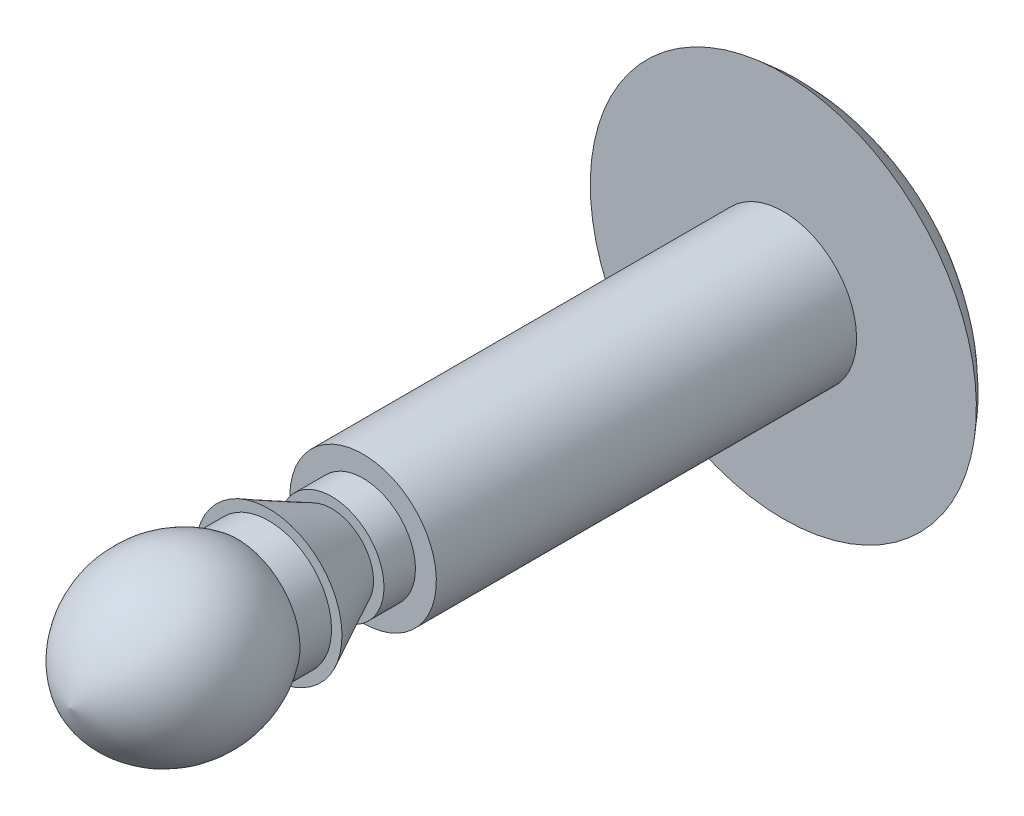
ISO-10303-21;
HEADER;
FILE_DESCRIPTION(('STEP AP214'),'2;1');
FILE_NAME('part.step','',(''),(''),'','','');
FILE_SCHEMA(('AUTOMOTIVE_DESIGN { 1 0 10303 214 1 1 1 1 }'));
ENDSEC;
DATA;
#1=APPLICATION_CONTEXT('core data for automotive mechanical design processes');
#2=APPLICATION_PROTOCOL_DEFINITION('international standard','automotive_design',2000,#1);
#3=PRODUCT_CONTEXT('',#1,'mechanical');
#4=PRODUCT('Part','Part','',(#3));
#5=PRODUCT_RELATED_PRODUCT_CATEGORY('part','',(#4));
#6=PRODUCT_DEFINITION_FORMATION('','',#4);
#7=PRODUCT_DEFINITION_CONTEXT('part definition',#1,'design');
#8=PRODUCT_DEFINITION('design','',#6,#7);
#9=PRODUCT_DEFINITION_SHAPE('','',#8);
#10=(LENGTH_UNIT() NAMED_UNIT(*) SI_UNIT(.MILLI.,.METRE.));
#11=(NAMED_UNIT(*) PLANE_ANGLE_UNIT() SI_UNIT($,.RADIAN.));
#12=(NAMED_UNIT(*) SI_UNIT($,.STERADIAN.) SOLID_ANGLE_UNIT());
#13=UNCERTAINTY_MEASURE_WITH_UNIT(LENGTH_MEASURE(1.E-05),#10,'distance_accuracy_value','');
#14=(GEOMETRIC_REPRESENTATION_CONTEXT(3) GLOBAL_UNCERTAINTY_ASSIGNED_CONTEXT((#13)) GLOBAL_UNIT_ASSIGNED_CONTEXT((#10,
#11,#12)) REPRESENTATION_CONTEXT('',''));
#15=CARTESIAN_POINT('',(0.,0.,0.));
#16=DIRECTION('',(0.,0.,1.));
#17=DIRECTION('',(1.,0.,0.));
#18=AXIS2_PLACEMENT_3D('',#15,#16,#17);
#19=CARTESIAN_POINT('',(0.,0.,-0.634999999999999));
#20=DIRECTION('',(0.,0.,1.));
#21=DIRECTION('',(0.,-1.,0.));
#22=AXIS2_PLACEMENT_3D('',#19,#20,#21);
#23=TOROIDAL_SURFACE('',#22,1.75895,0.762000000000001);
#24=CARTESIAN_POINT('',(0.,0.,-1.397));
#25=DIRECTION('',(0.,0.,1.));
#26=DIRECTION('',(0.,-1.,0.));
#27=AXIS2_PLACEMENT_3D('',#24,#25,#26);
#28=CIRCLE('',#27,1.75895);
#29=CARTESIAN_POINT('',(0.,-1.75895,-1.397));
#30=VERTEX_POINT('',#29);
#31=EDGE_CURVE('E78',#30,#30,#28,.T.);
#32=ORIENTED_EDGE('',*,*,#31,.F.);
#33=EDGE_LOOP('',(#32));
#34=FACE_BOUND('',#33,.T.);
#35=CARTESIAN_POINT('',(0.,0.,-1.016));
#36=DIRECTION('',(0.,0.,1.));
#37=DIRECTION('',(0.,-1.,0.));
#38=AXIS2_PLACEMENT_3D('',#35,#36,#37);
#39=CIRCLE('',#38,1.09903864231626);
#40=CARTESIAN_POINT('',(0.,-1.09903864231626,-1.016));
#41=VERTEX_POINT('',#40);
#42=EDGE_CURVE('E11',#41,#41,#39,.T.);
#43=ORIENTED_EDGE('',*,*,#42,.T.);
#44=EDGE_LOOP('',(#43));
#45=FACE_BOUND('',#44,.T.);
#46=ADVANCED_FACE('F32',(#34,#45),#23,.T.);
#47=CARTESIAN_POINT('',(0.,0.996949999999999,-1.016));
#48=DIRECTION('',(0.,0.,1.));
#49=DIRECTION('',(0.,-1.,0.));
#50=AXIS2_PLACEMENT_3D('',#47,#48,#49);
#51=PLANE('',#50);
#52=ORIENTED_EDGE('',*,*,#42,.F.);
#53=EDGE_LOOP('',(#52));
#54=FACE_BOUND('',#53,.T.);
#55=CARTESIAN_POINT('',(0.,0.,-1.016));
#56=DIRECTION('',(0.,0.,1.));
#57=DIRECTION('',(0.,-1.,0.));
#58=AXIS2_PLACEMENT_3D('',#55,#56,#57);
#59=CIRCLE('',#58,0.996949999999999);
#60=CARTESIAN_POINT('',(0.,-0.996949999999999,-1.016));
#61=VERTEX_POINT('',#60);
#62=EDGE_CURVE('E38',#61,#61,#59,.T.);
#63=ORIENTED_EDGE('',*,*,#62,.T.);
#64=EDGE_LOOP('',(#63));
#65=FACE_BOUND('',#64,.T.);
#66=ADVANCED_FACE('F98',(#54,#65),#51,.F.);
#67=CARTESIAN_POINT('',(0.,0.,9.66665911521708));
#68=DIRECTION('',(0.,0.,1.));
#69=DIRECTION('',(0.,-1.,0.));
#70=AXIS2_PLACEMENT_3D('',#67,#68,#69);
#71=CYLINDRICAL_SURFACE('',#70,0.996949999999999);
#72=CARTESIAN_POINT('',(0.,0.,-1.397));
#73=DIRECTION('',(0.,0.,1.));
#74=DIRECTION('',(1.,0.,0.));
#75=AXIS2_PLACEMENT_3D('',#72,#73,#74);
#76=CIRCLE('',#75,0.996949999999999);
#77=CARTESIAN_POINT('',(0.996949999999999,0.,-1.397));
#78=VERTEX_POINT('',#77);
#79=EDGE_CURVE('E81',#78,#78,#76,.T.);
#80=ORIENTED_EDGE('',*,*,#79,.T.);
#81=EDGE_LOOP('',(#80));
#82=FACE_BOUND('',#81,.T.);
#83=ORIENTED_EDGE('',*,*,#62,.F.);
#84=EDGE_LOOP('',(#83));
#85=FACE_BOUND('',#84,.T.);
#86=ADVANCED_FACE('F45',(#82,#85),#71,.T.);
#87=CARTESIAN_POINT('',(0.,0.542559025427277,14.5148481779648));
#88=DIRECTION('',(-1.,0.,0.));
#89=DIRECTION('',(0.,-1.,0.));
#90=AXIS2_PLACEMENT_3D('',#87,#88,#89);
#91=CIRCLE('',#90,2.53645902542728);
#92=TRIMMED_CURVE('',#91,(PARAMETER_VALUE(-1.35522648467591)),
(PARAMETER_VALUE(1.35522648467591)),.T.,.PARAMETER.);
#93=CARTESIAN_POINT('',(0.,0.,14.5148481779648));
#94=DIRECTION('',(0.,0.,1.));
#95=AXIS1_PLACEMENT('',#93,#94);
#96=SURFACE_OF_REVOLUTION('',#92,#95);
#97=CARTESIAN_POINT('',(0.,0.,16.9926));
#98=VERTEX_POINT('',#97);
#99=VERTEX_LOOP('',#98);
#100=FACE_BOUND('',#99,.T.);
#101=CARTESIAN_POINT('',(0.,0.,13.0048));
#102=DIRECTION('',(0.,0.,1.));
#103=DIRECTION('',(0.,-1.,0.));
#104=AXIS2_PLACEMENT_3D('',#101,#102,#103);
#105=CIRCLE('',#104,1.495425);
#106=CARTESIAN_POINT('',(0.,-1.495425,13.0048));
#107=VERTEX_POINT('',#106);
#108=EDGE_CURVE('E49',#107,#107,#105,.T.);
#109=ORIENTED_EDGE('',*,*,#108,.T.);
#110=EDGE_LOOP('',(#109));
#111=FACE_BOUND('',#110,.T.);
#112=ADVANCED_FACE('F41',(#100,#111),#96,.T.);
#113=CARTESIAN_POINT('',(0.,0.,9.66665911521708));
#114=DIRECTION('',(0.,0.,1.));
#115=DIRECTION('',(0.,-1.,0.));
#116=AXIS2_PLACEMENT_3D('',#113,#114,#115);
#117=CYLINDRICAL_SURFACE('',#116,1.495425);
#118=ORIENTED_EDGE('',*,*,#108,.F.);
#119=EDGE_LOOP('',(#118));
#120=FACE_BOUND('',#119,.T.);
#121=CARTESIAN_POINT('',(0.,0.,12.2555));
#122=DIRECTION('',(0.,0.,1.));
#123=DIRECTION('',(0.,-1.,0.));
#124=AXIS2_PLACEMENT_3D('',#121,#122,#123);
#125=CIRCLE('',#124,1.495425);
#126=CARTESIAN_POINT('',(0.,-1.495425,12.2555));
#127=VERTEX_POINT('',#126);
#128=EDGE_CURVE('E51',#127,#127,#125,.T.);
#129=ORIENTED_EDGE('',*,*,#128,.T.);
#130=EDGE_LOOP('',(#129));
#131=FACE_BOUND('',#130,.T.);
#132=ADVANCED_FACE('F44',(#120,#131),#117,.T.);
#133=CARTESIAN_POINT('',(0.,1.495425,12.2555));
#134=DIRECTION('',(0.,0.,-1.));
#135=DIRECTION('',(0.,1.,0.));
#136=AXIS2_PLACEMENT_3D('',#133,#134,#135);
#137=PLANE('',#136);
#138=ORIENTED_EDGE('',*,*,#128,.F.);
#139=EDGE_LOOP('',(#138));
#140=FACE_BOUND('',#139,.T.);
#141=CARTESIAN_POINT('',(0.,0.,12.2555));
#142=DIRECTION('',(0.,0.,1.));
#143=DIRECTION('',(0.,-1.,0.));
#144=AXIS2_PLACEMENT_3D('',#141,#142,#143);
#145=CIRCLE('',#144,1.7446625);
#146=CARTESIAN_POINT('',(0.,-1.7446625,12.2555));
#147=VERTEX_POINT('',#146);
#148=EDGE_CURVE('E55',#147,#147,#145,.T.);
#149=ORIENTED_EDGE('',*,*,#148,.T.);
#150=EDGE_LOOP('',(#149));
#151=FACE_BOUND('',#150,.T.);
#152=ADVANCED_FACE('F116',(#140,#151),#137,.F.);
#153=CARTESIAN_POINT('',(0.,0.,10.7569));
#154=DIRECTION('',(0.,0.,1.));
#155=DIRECTION('',(0.,-1.,0.));
#156=AXIS2_PLACEMENT_3D('',#153,#154,#155);
#157=CONICAL_SURFACE('',#156,0.99695,0.462799792332385);
#158=ORIENTED_EDGE('',*,*,#148,.F.);
#159=EDGE_LOOP('',(#158));
#160=FACE_BOUND('',#159,.T.);
#161=CARTESIAN_POINT('',(0.,0.,10.7569));
#162=DIRECTION('',(0.,0.,1.));
#163=DIRECTION('',(0.,-1.,0.));
#164=AXIS2_PLACEMENT_3D('',#161,#162,#163);
#165=CIRCLE('',#164,0.99695);
#166=CARTESIAN_POINT('',(0.,-0.99695,10.7569));
#167=VERTEX_POINT('',#166);
#168=EDGE_CURVE('E60',#167,#167,#165,.T.);
#169=ORIENTED_EDGE('',*,*,#168,.T.);
#170=EDGE_LOOP('',(#169));
#171=FACE_BOUND('',#170,.T.);
#172=ADVANCED_FACE('F119',(#160,#171),#157,.T.);
#173=CARTESIAN_POINT('',(0.,0.99695,10.7569));
#174=DIRECTION('',(0.,0.,-1.));
#175=DIRECTION('',(0.,1.,0.));
#176=AXIS2_PLACEMENT_3D('',#173,#174,#175);
#177=PLANE('',#176);
#178=ORIENTED_EDGE('',*,*,#168,.F.);
#179=EDGE_LOOP('',(#178));
#180=FACE_BOUND('',#179,.T.);
#181=CARTESIAN_POINT('',(0.,0.,10.7569));
#182=DIRECTION('',(0.,0.,1.));
#183=DIRECTION('',(0.,-1.,0.));
#184=AXIS2_PLACEMENT_3D('',#181,#182,#183);
#185=CIRCLE('',#184,1.2461875);
#186=CARTESIAN_POINT('',(0.,-1.2461875,10.7569));
#187=VERTEX_POINT('',#186);
#188=EDGE_CURVE('E63',#187,#187,#185,.T.);
#189=ORIENTED_EDGE('',*,*,#188,.T.);
#190=EDGE_LOOP('',(#189));
#191=FACE_BOUND('',#190,.T.);
#192=ADVANCED_FACE('F123',(#180,#191),#177,.F.);
#193=CARTESIAN_POINT('',(0.,0.,9.66665911521708));
#194=DIRECTION('',(0.,0.,1.));
#195=DIRECTION('',(0.,-1.,0.));
#196=AXIS2_PLACEMENT_3D('',#193,#194,#195);
#197=CYLINDRICAL_SURFACE('',#196,1.2461875);
#198=ORIENTED_EDGE('',*,*,#188,.F.);
#199=EDGE_LOOP('',(#198));
#200=FACE_BOUND('',#199,.T.);
#201=CARTESIAN_POINT('',(0.,0.,10.0076));
#202=DIRECTION('',(0.,0.,1.));
#203=DIRECTION('',(0.,-1.,0.));
#204=AXIS2_PLACEMENT_3D('',#201,#202,#203);
#205=CIRCLE('',#204,1.2461875);
#206=CARTESIAN_POINT('',(0.,-1.2461875,10.0076));
#207=VERTEX_POINT('',#206);
#208=EDGE_CURVE('E66',#207,#207,#205,.T.);
#209=ORIENTED_EDGE('',*,*,#208,.T.);
#210=EDGE_LOOP('',(#209));
#211=FACE_BOUND('',#210,.T.);
#212=ADVANCED_FACE('F127',(#200,#211),#197,.T.);
#213=CARTESIAN_POINT('',(0.,1.7446625,10.0076));
#214=DIRECTION('',(0.,0.,-1.));
#215=DIRECTION('',(0.,1.,0.));
#216=AXIS2_PLACEMENT_3D('',#213,#214,#215);
#217=PLANE('',#216);
#218=ORIENTED_EDGE('',*,*,#208,.F.);
#219=EDGE_LOOP('',(#218));
#220=FACE_BOUND('',#219,.T.);
#221=CARTESIAN_POINT('',(0.,0.,10.0076));
#222=DIRECTION('',(0.,0.,1.));
#223=DIRECTION('',(0.,-1.,0.));
#224=AXIS2_PLACEMENT_3D('',#221,#222,#223);
#225=CIRCLE('',#224,1.7446625);
#226=CARTESIAN_POINT('',(0.,-1.7446625,10.0076));
#227=VERTEX_POINT('',#226);
#228=EDGE_CURVE('E69',#227,#227,#225,.T.);
#229=ORIENTED_EDGE('',*,*,#228,.T.);
#230=EDGE_LOOP('',(#229));
#231=FACE_BOUND('',#230,.T.);
#232=ADVANCED_FACE('F131',(#220,#231),#217,.F.);
#233=CARTESIAN_POINT('',(0.,0.,9.66665911521708));
#234=DIRECTION('',(0.,0.,1.));
#235=DIRECTION('',(0.,-1.,0.));
#236=AXIS2_PLACEMENT_3D('',#233,#234,#235);
#237=CYLINDRICAL_SURFACE('',#236,1.7446625);
#238=ORIENTED_EDGE('',*,*,#228,.F.);
#239=EDGE_LOOP('',(#238));
#240=FACE_BOUND('',#239,.T.);
#241=CARTESIAN_POINT('',(0.,0.,0.));
#242=DIRECTION('',(0.,0.,1.));
#243=DIRECTION('',(0.,-1.,0.));
#244=AXIS2_PLACEMENT_3D('',#241,#242,#243);
#245=CIRCLE('',#244,1.7446625);
#246=CARTESIAN_POINT('',(0.,-1.7446625,0.));
#247=VERTEX_POINT('',#246);
#248=EDGE_CURVE('E72',#247,#247,#245,.T.);
#249=ORIENTED_EDGE('',*,*,#248,.T.);
#250=EDGE_LOOP('',(#249));
#251=FACE_BOUND('',#250,.T.);
#252=ADVANCED_FACE('F135',(#240,#251),#237,.T.);
#253=CARTESIAN_POINT('',(0.,1.7446625,0.));
#254=DIRECTION('',(0.,0.,-1.));
#255=DIRECTION('',(0.,1.,0.));
#256=AXIS2_PLACEMENT_3D('',#253,#254,#255);
#257=PLANE('',#256);
#258=ORIENTED_EDGE('',*,*,#248,.F.);
#259=EDGE_LOOP('',(#258));
#260=FACE_BOUND('',#259,.T.);
#261=CARTESIAN_POINT('',(0.,0.,0.));
#262=DIRECTION('',(0.,0.,1.));
#263=DIRECTION('',(0.,-1.,0.));
#264=AXIS2_PLACEMENT_3D('',#261,#262,#263);
#265=CIRCLE('',#264,4.5974);
#266=CARTESIAN_POINT('',(0.,-4.5974,0.));
#267=VERTEX_POINT('',#266);
#268=EDGE_CURVE('E75',#267,#267,#265,.T.);
#269=ORIENTED_EDGE('',*,*,#268,.T.);
#270=EDGE_LOOP('',(#269));
#271=FACE_BOUND('',#270,.T.);
#272=ADVANCED_FACE('F94',(#260,#271),#257,.F.);
#273=CARTESIAN_POINT('',(0.,0.,2.18510715909091));
#274=DIRECTION('',(0.,0.,1.));
#275=DIRECTION('',(0.,-1.,0.));
#276=AXIS2_PLACEMENT_3D('',#273,#274,#275);
#277=DEGENERATE_TOROIDAL_SURFACE('',#276,1.75895,3.58210715909091,.T.);
#278=ORIENTED_EDGE('',*,*,#268,.F.);
#279=EDGE_LOOP('',(#278));
#280=FACE_BOUND('',#279,.T.);
#281=ORIENTED_EDGE('',*,*,#31,.T.);
#282=EDGE_LOOP('',(#281));
#283=FACE_BOUND('',#282,.T.);
#284=ADVANCED_FACE('F89',(#280,#283),#277,.T.);
#285=CARTESIAN_POINT('',(0.,0.,-1.397));
#286=DIRECTION('',(0.,0.,1.));
#287=DIRECTION('',(1.,0.,0.));
#288=AXIS2_PLACEMENT_3D('',#285,#286,#287);
#289=PLANE('',#288);
#290=ORIENTED_EDGE('',*,*,#79,.F.);
#291=EDGE_LOOP('',(#290));
#292=FACE_BOUND('',#291,.T.);
#293=ADVANCED_FACE('F87',(#292),#289,.F.);
#294=CLOSED_SHELL('',(#46,#66,#86,#112,#132,#152,#172,#192,#212,#232,#252,#272,#284,#293));
#295=MANIFOLD_SOLID_BREP('B2',#294);
#296=ADVANCED_BREP_SHAPE_REPRESENTATION('',(#18,#295),#14);
#297=SHAPE_DEFINITION_REPRESENTATION(#9,#296);
ENDSEC;
END-ISO-10303-21;
